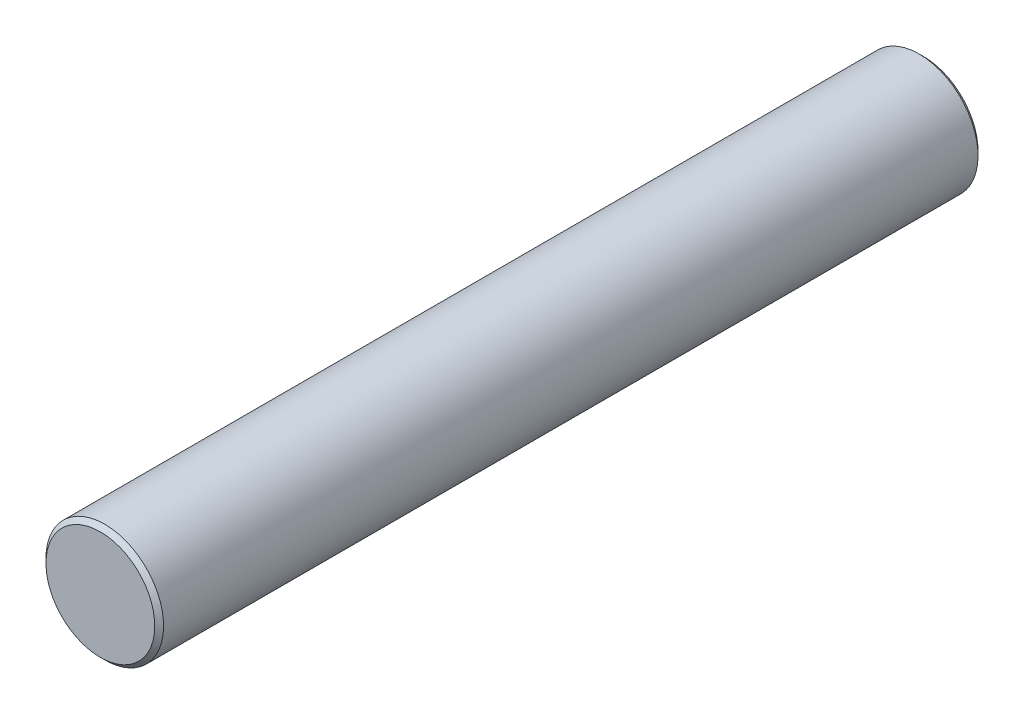
ISO-10303-21;
HEADER;
FILE_DESCRIPTION(('STEP AP214'),'2;1');
FILE_NAME('part.step','',(''),(''),'','','');
FILE_SCHEMA(('AUTOMOTIVE_DESIGN { 1 0 10303 214 1 1 1 1 }'));
ENDSEC;
DATA;
#1=APPLICATION_CONTEXT('core data for automotive mechanical design processes');
#2=APPLICATION_PROTOCOL_DEFINITION('international standard','automotive_design',2000,#1);
#3=PRODUCT_CONTEXT('',#1,'mechanical');
#4=PRODUCT('Part','Part','',(#3));
#5=PRODUCT_RELATED_PRODUCT_CATEGORY('part','',(#4));
#6=PRODUCT_DEFINITION_FORMATION('','',#4);
#7=PRODUCT_DEFINITION_CONTEXT('part definition',#1,'design');
#8=PRODUCT_DEFINITION('design','',#6,#7);
#9=PRODUCT_DEFINITION_SHAPE('','',#8);
#10=(LENGTH_UNIT() NAMED_UNIT(*) SI_UNIT(.MILLI.,.METRE.));
#11=(NAMED_UNIT(*) PLANE_ANGLE_UNIT() SI_UNIT($,.RADIAN.));
#12=(NAMED_UNIT(*) SI_UNIT($,.STERADIAN.) SOLID_ANGLE_UNIT());
#13=UNCERTAINTY_MEASURE_WITH_UNIT(LENGTH_MEASURE(1.E-05),#10,'distance_accuracy_value','');
#14=(GEOMETRIC_REPRESENTATION_CONTEXT(3) GLOBAL_UNCERTAINTY_ASSIGNED_CONTEXT((#13)) GLOBAL_UNIT_ASSIGNED_CONTEXT((#10,
#11,#12)) REPRESENTATION_CONTEXT('',''));
#15=CARTESIAN_POINT('',(0.,0.,0.));
#16=DIRECTION('',(0.,0.,1.));
#17=DIRECTION('',(1.,0.,0.));
#18=AXIS2_PLACEMENT_3D('',#15,#16,#17);
#19=CARTESIAN_POINT('',(0.,9.25,0.));
#20=DIRECTION('',(0.,0.,-1.));
#21=DIRECTION('',(0.,1.,0.));
#22=AXIS2_PLACEMENT_3D('',#19,#20,#21);
#23=PLANE('',#22);
#24=CARTESIAN_POINT('',(0.,0.,0.));
#25=DIRECTION('',(0.,0.,-1.));
#26=DIRECTION('',(0.,1.,0.));
#27=AXIS2_PLACEMENT_3D('',#24,#25,#26);
#28=CIRCLE('',#27,18.5);
#29=CARTESIAN_POINT('',(0.,18.5,0.));
#30=VERTEX_POINT('',#29);
#31=EDGE_CURVE('E9',#30,#30,#28,.T.);
#32=ORIENTED_EDGE('',*,*,#31,.T.);
#33=EDGE_LOOP('',(#32));
#34=FACE_BOUND('',#33,.T.);
#35=CARTESIAN_POINT('',(0.,0.,0.));
#36=DIRECTION('',(0.,0.,1.));
#37=DIRECTION('',(-1.,0.,0.));
#38=AXIS2_PLACEMENT_3D('',#35,#36,#37);
#39=CIRCLE('',#38,6.);
#40=CARTESIAN_POINT('',(-6.,0.,0.));
#41=VERTEX_POINT('',#40);
#42=EDGE_CURVE('E52',#41,#41,#39,.T.);
#43=ORIENTED_EDGE('',*,*,#42,.T.);
#44=EDGE_LOOP('',(#43));
#45=FACE_BOUND('',#44,.T.);
#46=ADVANCED_FACE('F15',(#34,#45),#23,.T.);
#47=CARTESIAN_POINT('',(0.,0.,0.75));
#48=DIRECTION('',(0.,0.,1.));
#49=DIRECTION('',(0.,1.,0.));
#50=AXIS2_PLACEMENT_3D('',#47,#48,#49);
#51=CONICAL_SURFACE('',#50,19.25,0.785398163397448);
#52=CARTESIAN_POINT('',(0.,0.,1.5));
#53=DIRECTION('',(0.,0.,-1.));
#54=DIRECTION('',(0.,1.,0.));
#55=AXIS2_PLACEMENT_3D('',#52,#53,#54);
#56=CIRCLE('',#55,20.);
#57=CARTESIAN_POINT('',(0.,20.,1.5));
#58=VERTEX_POINT('',#57);
#59=EDGE_CURVE('E25',#58,#58,#56,.T.);
#60=ORIENTED_EDGE('',*,*,#59,.T.);
#61=EDGE_LOOP('',(#60));
#62=FACE_BOUND('',#61,.T.);
#63=ORIENTED_EDGE('',*,*,#31,.F.);
#64=EDGE_LOOP('',(#63));
#65=FACE_BOUND('',#64,.T.);
#66=ADVANCED_FACE('F121',(#62,#65),#51,.T.);
#67=CARTESIAN_POINT('',(0.,0.,140.));
#68=DIRECTION('',(0.,0.,1.));
#69=DIRECTION('',(0.,1.,0.));
#70=AXIS2_PLACEMENT_3D('',#67,#68,#69);
#71=CYLINDRICAL_SURFACE('',#70,20.);
#72=CARTESIAN_POINT('',(0.,0.,278.5));
#73=DIRECTION('',(0.,0.,-1.));
#74=DIRECTION('',(0.,1.,0.));
#75=AXIS2_PLACEMENT_3D('',#72,#73,#74);
#76=CIRCLE('',#75,20.);
#77=CARTESIAN_POINT('',(0.,20.,278.5));
#78=VERTEX_POINT('',#77);
#79=EDGE_CURVE('E19',#78,#78,#76,.T.);
#80=ORIENTED_EDGE('',*,*,#79,.T.);
#81=EDGE_LOOP('',(#80));
#82=FACE_BOUND('',#81,.T.);
#83=ORIENTED_EDGE('',*,*,#59,.F.);
#84=EDGE_LOOP('',(#83));
#85=FACE_BOUND('',#84,.T.);
#86=CARTESIAN_POINT('',(0.,0.,6.5));
#87=DIRECTION('',(0.,0.,-1.));
#88=DIRECTION('',(0.,1.,0.));
#89=AXIS2_PLACEMENT_3D('',#86,#87,#88);
#90=CIRCLE('',#89,20.);
#91=CARTESIAN_POINT('',(10.5356537528527,-17.,6.5));
#92=VERTEX_POINT('',#91);
#93=CARTESIAN_POINT('',(-10.5356537528527,-17.,6.5));
#94=VERTEX_POINT('',#93);
#95=EDGE_CURVE('E69',#92,#94,#90,.T.);
#96=ORIENTED_EDGE('',*,*,#95,.T.);
#97=DIRECTION('',(0.,0.,1.));
#98=VECTOR('',#97,1.);
#99=CARTESIAN_POINT('',(-10.5356537528527,-17.,8.25));
#100=LINE('',#99,#98);
#101=CARTESIAN_POINT('',(-10.5356537528527,-17.,10.));
#102=VERTEX_POINT('',#101);
#103=EDGE_CURVE('E62',#94,#102,#100,.T.);
#104=ORIENTED_EDGE('',*,*,#103,.T.);
#105=CARTESIAN_POINT('',(0.,0.,10.));
#106=DIRECTION('',(0.,0.,1.));
#107=DIRECTION('',(0.,1.,0.));
#108=AXIS2_PLACEMENT_3D('',#105,#106,#107);
#109=CIRCLE('',#108,20.);
#110=CARTESIAN_POINT('',(10.5356537528527,-17.,10.));
#111=VERTEX_POINT('',#110);
#112=EDGE_CURVE('E75',#102,#111,#109,.T.);
#113=ORIENTED_EDGE('',*,*,#112,.T.);
#114=DIRECTION('',(0.,0.,-1.));
#115=VECTOR('',#114,1.);
#116=CARTESIAN_POINT('',(10.5356537528527,-17.,8.25));
#117=LINE('',#116,#115);
#118=EDGE_CURVE('E60',#111,#92,#117,.T.);
#119=ORIENTED_EDGE('',*,*,#118,.T.);
#120=EDGE_LOOP('',(#96,#104,#113,#119));
#121=FACE_BOUND('',#120,.T.);
#122=ADVANCED_FACE('F17',(#82,#85,#121),#71,.T.);
#123=CARTESIAN_POINT('',(0.,0.,279.25));
#124=DIRECTION('',(0.,0.,-1.));
#125=DIRECTION('',(0.,1.,0.));
#126=AXIS2_PLACEMENT_3D('',#123,#124,#125);
#127=CONICAL_SURFACE('',#126,19.25,0.785398163397448);
#128=CARTESIAN_POINT('',(0.,0.,280.));
#129=DIRECTION('',(0.,0.,-1.));
#130=DIRECTION('',(0.,1.,0.));
#131=AXIS2_PLACEMENT_3D('',#128,#129,#130);
#132=CIRCLE('',#131,18.5);
#133=CARTESIAN_POINT('',(0.,18.5,280.));
#134=VERTEX_POINT('',#133);
#135=EDGE_CURVE('E44',#134,#134,#132,.T.);
#136=ORIENTED_EDGE('',*,*,#135,.T.);
#137=EDGE_LOOP('',(#136));
#138=FACE_BOUND('',#137,.T.);
#139=ORIENTED_EDGE('',*,*,#79,.F.);
#140=EDGE_LOOP('',(#139));
#141=FACE_BOUND('',#140,.T.);
#142=ADVANCED_FACE('F116',(#138,#141),#127,.T.);
#143=CARTESIAN_POINT('',(0.,9.25,280.));
#144=DIRECTION('',(0.,0.,1.));
#145=DIRECTION('',(0.,-1.,0.));
#146=AXIS2_PLACEMENT_3D('',#143,#144,#145);
#147=PLANE('',#146);
#148=ORIENTED_EDGE('',*,*,#135,.F.);
#149=EDGE_LOOP('',(#148));
#150=FACE_BOUND('',#149,.T.);
#151=ADVANCED_FACE('F110',(#150),#147,.T.);
#152=CARTESIAN_POINT('',(0.,0.,26.4586213285198));
#153=DIRECTION('',(0.,0.,-1.));
#154=DIRECTION('',(-1.,0.,0.));
#155=AXIS2_PLACEMENT_3D('',#152,#153,#154);
#156=CONICAL_SURFACE('',#155,2.52640625,1.0471975511966);
#157=CARTESIAN_POINT('',(0.,0.,25.));
#158=DIRECTION('',(0.,0.,1.));
#159=DIRECTION('',(-1.,0.,0.));
#160=AXIS2_PLACEMENT_3D('',#157,#158,#159);
#161=CIRCLE('',#160,5.0528125);
#162=CARTESIAN_POINT('',(-5.0528125,0.,25.));
#163=VERTEX_POINT('',#162);
#164=EDGE_CURVE('E51',#163,#163,#161,.T.);
#165=ORIENTED_EDGE('',*,*,#164,.F.);
#166=EDGE_LOOP('',(#165));
#167=FACE_BOUND('',#166,.T.);
#168=CARTESIAN_POINT('',(0.,0.,27.9172426570397));
#169=VERTEX_POINT('',#168);
#170=VERTEX_LOOP('',#169);
#171=FACE_BOUND('',#170,.T.);
#172=ADVANCED_FACE('F104',(#167,#171),#156,.F.);
#173=CARTESIAN_POINT('',(0.,0.,12.97359375));
#174=DIRECTION('',(0.,0.,-1.));
#175=DIRECTION('',(-1.,0.,0.));
#176=AXIS2_PLACEMENT_3D('',#173,#174,#175);
#177=CYLINDRICAL_SURFACE('',#176,5.0528125);
#178=CARTESIAN_POINT('',(0.,0.,0.9471875));
#179=DIRECTION('',(0.,0.,1.));
#180=DIRECTION('',(-1.,0.,0.));
#181=AXIS2_PLACEMENT_3D('',#178,#179,#180);
#182=CIRCLE('',#181,5.0528125);
#183=CARTESIAN_POINT('',(-5.0528125,0.,0.9471875));
#184=VERTEX_POINT('',#183);
#185=EDGE_CURVE('E57',#184,#184,#182,.T.);
#186=ORIENTED_EDGE('',*,*,#185,.F.);
#187=EDGE_LOOP('',(#186));
#188=FACE_BOUND('',#187,.T.);
#189=ORIENTED_EDGE('',*,*,#164,.T.);
#190=EDGE_LOOP('',(#189));
#191=FACE_BOUND('',#190,.T.);
#192=ADVANCED_FACE('F101',(#188,#191),#177,.F.);
#193=CARTESIAN_POINT('',(0.,0.,0.47359375));
#194=DIRECTION('',(0.,0.,-1.));
#195=DIRECTION('',(-1.,0.,0.));
#196=AXIS2_PLACEMENT_3D('',#193,#194,#195);
#197=CONICAL_SURFACE('',#196,5.52640625,0.785398163397448);
#198=ORIENTED_EDGE('',*,*,#42,.F.);
#199=EDGE_LOOP('',(#198));
#200=FACE_BOUND('',#199,.T.);
#201=ORIENTED_EDGE('',*,*,#185,.T.);
#202=EDGE_LOOP('',(#201));
#203=FACE_BOUND('',#202,.T.);
#204=ADVANCED_FACE('F99',(#200,#203),#197,.F.);
#205=CARTESIAN_POINT('',(0.,-17.,8.25));
#206=DIRECTION('',(0.,-1.,0.));
#207=DIRECTION('',(0.,0.,-1.));
#208=AXIS2_PLACEMENT_3D('',#205,#206,#207);
#209=PLANE('',#208);
#210=ORIENTED_EDGE('',*,*,#103,.F.);
#211=DIRECTION('',(1.,0.,0.));
#212=VECTOR('',#211,1.);
#213=CARTESIAN_POINT('',(0.,-17.,6.5));
#214=LINE('',#213,#212);
#215=EDGE_CURVE('E66',#94,#92,#214,.T.);
#216=ORIENTED_EDGE('',*,*,#215,.T.);
#217=ORIENTED_EDGE('',*,*,#118,.F.);
#218=DIRECTION('',(-1.,0.,0.));
#219=VECTOR('',#218,1.);
#220=CARTESIAN_POINT('',(0.,-17.,10.));
#221=LINE('',#220,#219);
#222=EDGE_CURVE('E72',#111,#102,#221,.T.);
#223=ORIENTED_EDGE('',*,*,#222,.T.);
#224=EDGE_LOOP('',(#210,#216,#217,#223));
#225=FACE_BOUND('',#224,.T.);
#226=ADVANCED_FACE('F131',(#225),#209,.T.);
#227=CARTESIAN_POINT('',(0.,-19.5,6.5));
#228=DIRECTION('',(0.,0.,1.));
#229=DIRECTION('',(1.,0.,0.));
#230=AXIS2_PLACEMENT_3D('',#227,#228,#229);
#231=PLANE('',#230);
#232=ORIENTED_EDGE('',*,*,#95,.F.);
#233=ORIENTED_EDGE('',*,*,#215,.F.);
#234=EDGE_LOOP('',(#232,#233));
#235=FACE_BOUND('',#234,.T.);
#236=ADVANCED_FACE('F135',(#235),#231,.T.);
#237=CARTESIAN_POINT('',(0.,-19.5,10.));
#238=DIRECTION('',(0.,0.,1.));
#239=DIRECTION('',(1.,0.,0.));
#240=AXIS2_PLACEMENT_3D('',#237,#238,#239);
#241=PLANE('',#240);
#242=ORIENTED_EDGE('',*,*,#112,.F.);
#243=ORIENTED_EDGE('',*,*,#222,.F.);
#244=EDGE_LOOP('',(#242,#243));
#245=FACE_BOUND('',#244,.T.);
#246=ADVANCED_FACE('F87',(#245),#241,.F.);
#247=CLOSED_SHELL('',(#46,#66,#122,#142,#151,#172,#192,#204,#226,#236,#246));
#248=MANIFOLD_SOLID_BREP('B1',#247);
#249=ADVANCED_BREP_SHAPE_REPRESENTATION('',(#18,#248),#14);
#250=SHAPE_DEFINITION_REPRESENTATION(#9,#249);
ENDSEC;
END-ISO-10303-21;
